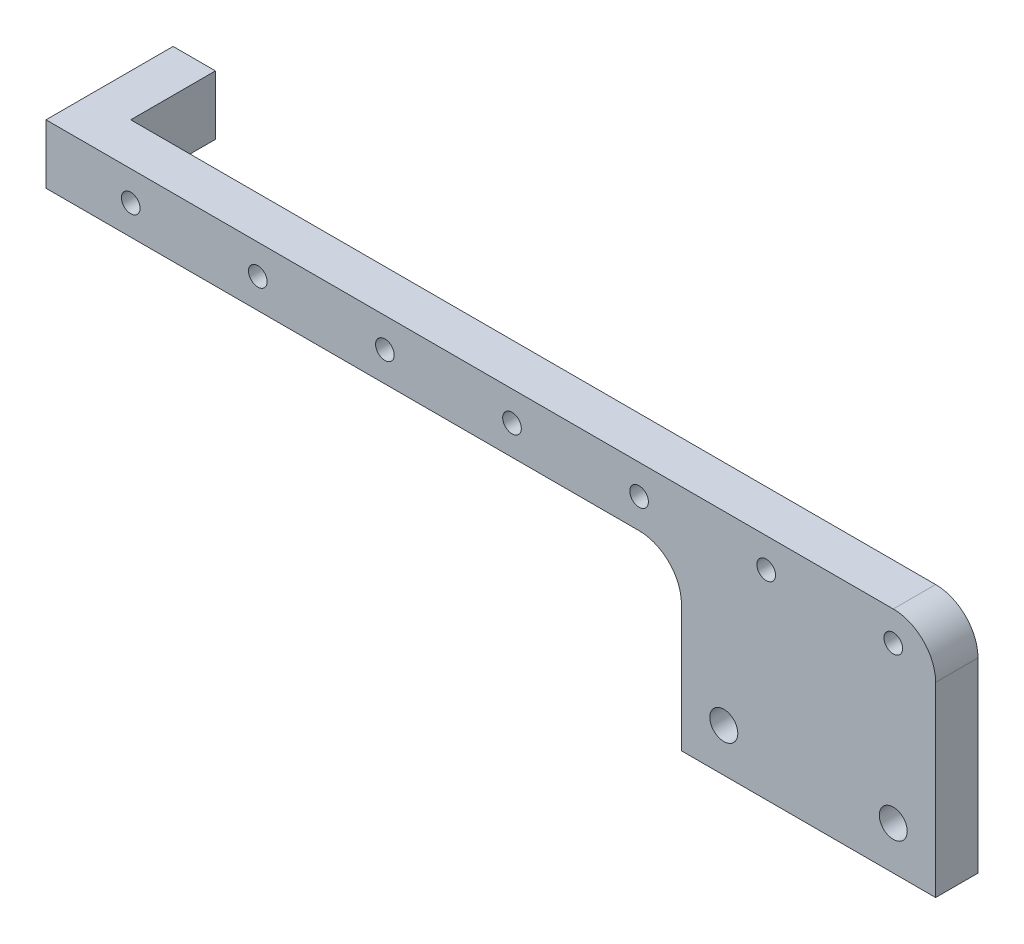
ISO-10303-21;
HEADER;
FILE_DESCRIPTION(('STEP AP214'),'2;1');
FILE_NAME('part.step','',(''),(''),'','','');
FILE_SCHEMA(('AUTOMOTIVE_DESIGN { 1 0 10303 214 1 1 1 1 }'));
ENDSEC;
DATA;
#1=APPLICATION_CONTEXT('core data for automotive mechanical design processes');
#2=APPLICATION_PROTOCOL_DEFINITION('international standard','automotive_design',2000,#1);
#3=PRODUCT_CONTEXT('',#1,'mechanical');
#4=PRODUCT('Part','Part','',(#3));
#5=PRODUCT_RELATED_PRODUCT_CATEGORY('part','',(#4));
#6=PRODUCT_DEFINITION_FORMATION('','',#4);
#7=PRODUCT_DEFINITION_CONTEXT('part definition',#1,'design');
#8=PRODUCT_DEFINITION('design','',#6,#7);
#9=PRODUCT_DEFINITION_SHAPE('','',#8);
#10=(LENGTH_UNIT() NAMED_UNIT(*) SI_UNIT(.MILLI.,.METRE.));
#11=(NAMED_UNIT(*) PLANE_ANGLE_UNIT() SI_UNIT($,.RADIAN.));
#12=(NAMED_UNIT(*) SI_UNIT($,.STERADIAN.) SOLID_ANGLE_UNIT());
#13=UNCERTAINTY_MEASURE_WITH_UNIT(LENGTH_MEASURE(1.E-05),#10,'distance_accuracy_value','');
#14=(GEOMETRIC_REPRESENTATION_CONTEXT(3) GLOBAL_UNCERTAINTY_ASSIGNED_CONTEXT((#13)) GLOBAL_UNIT_ASSIGNED_CONTEXT((#10,
#11,#12)) REPRESENTATION_CONTEXT('',''));
#15=CARTESIAN_POINT('',(0.,0.,0.));
#16=DIRECTION('',(0.,0.,1.));
#17=DIRECTION('',(1.,0.,0.));
#18=AXIS2_PLACEMENT_3D('',#15,#16,#17);
#19=CARTESIAN_POINT('',(0.,0.,5.));
#20=DIRECTION('',(0.,1.,0.));
#21=DIRECTION('',(0.,0.,1.));
#22=AXIS2_PLACEMENT_3D('',#19,#20,#21);
#23=PLANE('',#22);
#24=DIRECTION('',(1.,0.,0.));
#25=VECTOR('',#24,1.);
#26=CARTESIAN_POINT('',(0.,0.,0.));
#27=LINE('',#26,#25);
#28=CARTESIAN_POINT('',(0.,0.,0.));
#29=VERTEX_POINT('',#28);
#30=CARTESIAN_POINT('',(65.,0.,0.));
#31=VERTEX_POINT('',#30);
#32=EDGE_CURVE('E228',#29,#31,#27,.T.);
#33=ORIENTED_EDGE('',*,*,#32,.T.);
#34=DIRECTION('',(0.,0.,-1.));
#35=VECTOR('',#34,1.);
#36=CARTESIAN_POINT('',(65.,0.,5.));
#37=LINE('',#36,#35);
#38=CARTESIAN_POINT('',(65.,0.,5.));
#39=VERTEX_POINT('',#38);
#40=EDGE_CURVE('E234',#31,#39,#37,.F.);
#41=ORIENTED_EDGE('',*,*,#40,.T.);
#42=DIRECTION('',(1.,0.,0.));
#43=VECTOR('',#42,1.);
#44=CARTESIAN_POINT('',(0.,0.,5.));
#45=LINE('',#44,#43);
#46=CARTESIAN_POINT('',(-5.,0.,5.));
#47=VERTEX_POINT('',#46);
#48=EDGE_CURVE('E221',#47,#39,#45,.T.);
#49=ORIENTED_EDGE('',*,*,#48,.F.);
#50=DIRECTION('',(0.,0.,1.));
#51=VECTOR('',#50,1.);
#52=CARTESIAN_POINT('',(-5.,0.,-10.));
#53=LINE('',#52,#51);
#54=CARTESIAN_POINT('',(-5.,0.,-10.));
#55=VERTEX_POINT('',#54);
#56=EDGE_CURVE('E154',#55,#47,#53,.T.);
#57=ORIENTED_EDGE('',*,*,#56,.F.);
#58=DIRECTION('',(1.,0.,0.));
#59=VECTOR('',#58,1.);
#60=CARTESIAN_POINT('',(0.,0.,-10.));
#61=LINE('',#60,#59);
#62=CARTESIAN_POINT('',(0.,0.,-10.));
#63=VERTEX_POINT('',#62);
#64=EDGE_CURVE('E127',#55,#63,#61,.T.);
#65=ORIENTED_EDGE('',*,*,#64,.T.);
#66=DIRECTION('',(0.,0.,1.));
#67=VECTOR('',#66,1.);
#68=CARTESIAN_POINT('',(0.,0.,-10.));
#69=LINE('',#68,#67);
#70=EDGE_CURVE('E141',#63,#29,#69,.T.);
#71=ORIENTED_EDGE('',*,*,#70,.T.);
#72=EDGE_LOOP('',(#33,#41,#49,#57,#65,#71));
#73=FACE_BOUND('',#72,.T.);
#74=ADVANCED_FACE('F39',(#73),#23,.F.);
#75=CARTESIAN_POINT('',(0.,7.,5.));
#76=DIRECTION('',(0.,1.,0.));
#77=DIRECTION('',(0.,0.,1.));
#78=AXIS2_PLACEMENT_3D('',#75,#76,#77);
#79=PLANE('',#78);
#80=DIRECTION('',(1.,0.,0.));
#81=VECTOR('',#80,1.);
#82=CARTESIAN_POINT('',(0.,7.,5.));
#83=LINE('',#82,#81);
#84=CARTESIAN_POINT('',(-5.,7.,5.));
#85=VERTEX_POINT('',#84);
#86=CARTESIAN_POINT('',(95.,7.,5.));
#87=VERTEX_POINT('',#86);
#88=EDGE_CURVE('E216',#85,#87,#83,.T.);
#89=ORIENTED_EDGE('',*,*,#88,.T.);
#90=DIRECTION('',(0.,0.,-1.));
#91=VECTOR('',#90,1.);
#92=CARTESIAN_POINT('',(95.,7.,0.));
#93=LINE('',#92,#91);
#94=CARTESIAN_POINT('',(95.,7.,0.));
#95=VERTEX_POINT('',#94);
#96=EDGE_CURVE('E236',#87,#95,#93,.T.);
#97=ORIENTED_EDGE('',*,*,#96,.T.);
#98=DIRECTION('',(1.,0.,0.));
#99=VECTOR('',#98,1.);
#100=CARTESIAN_POINT('',(0.,7.,0.));
#101=LINE('',#100,#99);
#102=CARTESIAN_POINT('',(0.,7.,0.));
#103=VERTEX_POINT('',#102);
#104=EDGE_CURVE('E122',#103,#95,#101,.T.);
#105=ORIENTED_EDGE('',*,*,#104,.F.);
#106=DIRECTION('',(0.,0.,1.));
#107=VECTOR('',#106,1.);
#108=CARTESIAN_POINT('',(0.,7.,-10.));
#109=LINE('',#108,#107);
#110=CARTESIAN_POINT('',(0.,7.,-10.));
#111=VERTEX_POINT('',#110);
#112=EDGE_CURVE('E115',#111,#103,#109,.T.);
#113=ORIENTED_EDGE('',*,*,#112,.F.);
#114=DIRECTION('',(-1.,0.,0.));
#115=VECTOR('',#114,1.);
#116=CARTESIAN_POINT('',(0.,7.,-10.));
#117=LINE('',#116,#115);
#118=CARTESIAN_POINT('',(-5.,7.,-10.));
#119=VERTEX_POINT('',#118);
#120=EDGE_CURVE('E120',#111,#119,#117,.T.);
#121=ORIENTED_EDGE('',*,*,#120,.T.);
#122=DIRECTION('',(0.,0.,1.));
#123=VECTOR('',#122,1.);
#124=CARTESIAN_POINT('',(-5.,7.,-10.));
#125=LINE('',#124,#123);
#126=EDGE_CURVE('E126',#119,#85,#125,.T.);
#127=ORIENTED_EDGE('',*,*,#126,.T.);
#128=EDGE_LOOP('',(#89,#97,#105,#113,#121,#127));
#129=FACE_BOUND('',#128,.T.);
#130=ADVANCED_FACE('F118',(#129),#79,.T.);
#131=CARTESIAN_POINT('',(100.,0.,5.));
#132=DIRECTION('',(-1.,0.,0.));
#133=DIRECTION('',(0.,0.,1.));
#134=AXIS2_PLACEMENT_3D('',#131,#132,#133);
#135=PLANE('',#134);
#136=DIRECTION('',(0.,1.,0.));
#137=VECTOR('',#136,1.);
#138=CARTESIAN_POINT('',(100.,0.,0.));
#139=LINE('',#138,#137);
#140=CARTESIAN_POINT('',(100.,-20.,0.));
#141=VERTEX_POINT('',#140);
#142=CARTESIAN_POINT('',(100.,2.,0.));
#143=VERTEX_POINT('',#142);
#144=EDGE_CURVE('E226',#141,#143,#139,.T.);
#145=ORIENTED_EDGE('',*,*,#144,.T.);
#146=DIRECTION('',(0.,0.,-1.));
#147=VECTOR('',#146,1.);
#148=CARTESIAN_POINT('',(100.,2.,5.));
#149=LINE('',#148,#147);
#150=CARTESIAN_POINT('',(100.,2.,5.));
#151=VERTEX_POINT('',#150);
#152=EDGE_CURVE('E54',#143,#151,#149,.F.);
#153=ORIENTED_EDGE('',*,*,#152,.T.);
#154=DIRECTION('',(0.,1.,0.));
#155=VECTOR('',#154,1.);
#156=CARTESIAN_POINT('',(100.,0.,5.));
#157=LINE('',#156,#155);
#158=CARTESIAN_POINT('',(100.,-20.,5.));
#159=VERTEX_POINT('',#158);
#160=EDGE_CURVE('E218',#159,#151,#157,.T.);
#161=ORIENTED_EDGE('',*,*,#160,.F.);
#162=DIRECTION('',(0.,0.,-1.));
#163=VECTOR('',#162,1.);
#164=CARTESIAN_POINT('',(100.,-20.,5.));
#165=LINE('',#164,#163);
#166=EDGE_CURVE('E165',#159,#141,#165,.T.);
#167=ORIENTED_EDGE('',*,*,#166,.T.);
#168=EDGE_LOOP('',(#145,#153,#161,#167));
#169=FACE_BOUND('',#168,.T.);
#170=ADVANCED_FACE('F281',(#169),#135,.F.);
#171=CARTESIAN_POINT('',(0.,0.,5.));
#172=DIRECTION('',(0.,0.,1.));
#173=DIRECTION('',(1.,0.,0.));
#174=AXIS2_PLACEMENT_3D('',#171,#172,#173);
#175=PLANE('',#174);
#176=CARTESIAN_POINT('',(95.,-14.9,5.));
#177=DIRECTION('',(0.,0.,1.));
#178=DIRECTION('',(1.,0.,0.));
#179=AXIS2_PLACEMENT_3D('',#176,#177,#178);
#180=CIRCLE('',#179,1.65);
#181=CARTESIAN_POINT('',(96.65,-14.9,5.));
#182=VERTEX_POINT('',#181);
#183=EDGE_CURVE('E145',#182,#182,#180,.T.);
#184=ORIENTED_EDGE('',*,*,#183,.F.);
#185=EDGE_LOOP('',(#184));
#186=FACE_BOUND('',#185,.T.);
#187=CARTESIAN_POINT('',(75.,-14.9,5.));
#188=DIRECTION('',(0.,0.,1.));
#189=DIRECTION('',(1.,0.,0.));
#190=AXIS2_PLACEMENT_3D('',#187,#188,#189);
#191=CIRCLE('',#190,1.65);
#192=CARTESIAN_POINT('',(76.65,-14.9,5.));
#193=VERTEX_POINT('',#192);
#194=EDGE_CURVE('E307',#193,#193,#191,.T.);
#195=ORIENTED_EDGE('',*,*,#194,.F.);
#196=EDGE_LOOP('',(#195));
#197=FACE_BOUND('',#196,.T.);
#198=CARTESIAN_POINT('',(95.,3.5,5.));
#199=DIRECTION('',(0.,0.,-1.));
#200=DIRECTION('',(-1.,0.,0.));
#201=AXIS2_PLACEMENT_3D('',#198,#199,#200);
#202=CIRCLE('',#201,1.10000000000001);
#203=CARTESIAN_POINT('',(93.9,3.5,5.));
#204=VERTEX_POINT('',#203);
#205=EDGE_CURVE('E175',#204,#204,#202,.T.);
#206=ORIENTED_EDGE('',*,*,#205,.T.);
#207=EDGE_LOOP('',(#206));
#208=FACE_BOUND('',#207,.T.);
#209=CARTESIAN_POINT('',(80.,3.5,5.));
#210=DIRECTION('',(0.,0.,-1.));
#211=DIRECTION('',(-1.,0.,0.));
#212=AXIS2_PLACEMENT_3D('',#209,#210,#211);
#213=CIRCLE('',#212,1.10000000000001);
#214=CARTESIAN_POINT('',(78.9,3.5,5.));
#215=VERTEX_POINT('',#214);
#216=EDGE_CURVE('E184',#215,#215,#213,.T.);
#217=ORIENTED_EDGE('',*,*,#216,.T.);
#218=EDGE_LOOP('',(#217));
#219=FACE_BOUND('',#218,.T.);
#220=CARTESIAN_POINT('',(65.,3.5,5.));
#221=DIRECTION('',(0.,0.,-1.));
#222=DIRECTION('',(-1.,0.,0.));
#223=AXIS2_PLACEMENT_3D('',#220,#221,#222);
#224=CIRCLE('',#223,1.10000000000001);
#225=CARTESIAN_POINT('',(63.9,3.5,5.));
#226=VERTEX_POINT('',#225);
#227=EDGE_CURVE('E190',#226,#226,#224,.T.);
#228=ORIENTED_EDGE('',*,*,#227,.T.);
#229=EDGE_LOOP('',(#228));
#230=FACE_BOUND('',#229,.T.);
#231=CARTESIAN_POINT('',(50.,3.5,5.));
#232=DIRECTION('',(0.,0.,-1.));
#233=DIRECTION('',(-1.,0.,0.));
#234=AXIS2_PLACEMENT_3D('',#231,#232,#233);
#235=CIRCLE('',#234,1.10000000000001);
#236=CARTESIAN_POINT('',(48.9,3.5,5.));
#237=VERTEX_POINT('',#236);
#238=EDGE_CURVE('E196',#237,#237,#235,.T.);
#239=ORIENTED_EDGE('',*,*,#238,.T.);
#240=EDGE_LOOP('',(#239));
#241=FACE_BOUND('',#240,.T.);
#242=CARTESIAN_POINT('',(35.,3.5,5.));
#243=DIRECTION('',(0.,0.,-1.));
#244=DIRECTION('',(-1.,0.,0.));
#245=AXIS2_PLACEMENT_3D('',#242,#243,#244);
#246=CIRCLE('',#245,1.10000000000001);
#247=CARTESIAN_POINT('',(33.9,3.5,5.));
#248=VERTEX_POINT('',#247);
#249=EDGE_CURVE('E202',#248,#248,#246,.T.);
#250=ORIENTED_EDGE('',*,*,#249,.T.);
#251=EDGE_LOOP('',(#250));
#252=FACE_BOUND('',#251,.T.);
#253=CARTESIAN_POINT('',(20.,3.5,5.));
#254=DIRECTION('',(0.,0.,-1.));
#255=DIRECTION('',(-1.,0.,0.));
#256=AXIS2_PLACEMENT_3D('',#253,#254,#255);
#257=CIRCLE('',#256,1.10000000000001);
#258=CARTESIAN_POINT('',(18.9,3.5,5.));
#259=VERTEX_POINT('',#258);
#260=EDGE_CURVE('E208',#259,#259,#257,.T.);
#261=ORIENTED_EDGE('',*,*,#260,.T.);
#262=EDGE_LOOP('',(#261));
#263=FACE_BOUND('',#262,.T.);
#264=CARTESIAN_POINT('',(4.99999999999999,3.5,5.));
#265=DIRECTION('',(0.,0.,-1.));
#266=DIRECTION('',(-1.,0.,0.));
#267=AXIS2_PLACEMENT_3D('',#264,#265,#266);
#268=CIRCLE('',#267,1.10000000000001);
#269=CARTESIAN_POINT('',(3.89999999999998,3.5,5.));
#270=VERTEX_POINT('',#269);
#271=EDGE_CURVE('E172',#270,#270,#268,.T.);
#272=ORIENTED_EDGE('',*,*,#271,.T.);
#273=EDGE_LOOP('',(#272));
#274=FACE_BOUND('',#273,.T.);
#275=ORIENTED_EDGE('',*,*,#160,.T.);
#276=CARTESIAN_POINT('',(95.,2.,5.));
#277=DIRECTION('',(0.,0.,1.));
#278=DIRECTION('',(1.,0.,0.));
#279=AXIS2_PLACEMENT_3D('',#276,#277,#278);
#280=CIRCLE('',#279,5.);
#281=EDGE_CURVE('E240',#151,#87,#280,.T.);
#282=ORIENTED_EDGE('',*,*,#281,.T.);
#283=ORIENTED_EDGE('',*,*,#88,.F.);
#284=DIRECTION('',(0.,-1.,0.));
#285=VECTOR('',#284,1.);
#286=CARTESIAN_POINT('',(-5.,0.,5.));
#287=LINE('',#286,#285);
#288=EDGE_CURVE('E142',#85,#47,#287,.T.);
#289=ORIENTED_EDGE('',*,*,#288,.T.);
#290=ORIENTED_EDGE('',*,*,#48,.T.);
#291=CARTESIAN_POINT('',(65.,-5.,5.));
#292=DIRECTION('',(0.,0.,1.));
#293=DIRECTION('',(1.,0.,0.));
#294=AXIS2_PLACEMENT_3D('',#291,#292,#293);
#295=CIRCLE('',#294,5.);
#296=CARTESIAN_POINT('',(70.,-5.,5.));
#297=VERTEX_POINT('',#296);
#298=EDGE_CURVE('E11',#39,#297,#295,.F.);
#299=ORIENTED_EDGE('',*,*,#298,.T.);
#300=DIRECTION('',(0.,1.,0.));
#301=VECTOR('',#300,1.);
#302=CARTESIAN_POINT('',(70.,0.,5.));
#303=LINE('',#302,#301);
#304=CARTESIAN_POINT('',(70.,-20.,5.));
#305=VERTEX_POINT('',#304);
#306=EDGE_CURVE('E161',#305,#297,#303,.T.);
#307=ORIENTED_EDGE('',*,*,#306,.F.);
#308=DIRECTION('',(-1.,0.,0.));
#309=VECTOR('',#308,1.);
#310=CARTESIAN_POINT('',(100.,-20.,5.));
#311=LINE('',#310,#309);
#312=EDGE_CURVE('E158',#159,#305,#311,.T.);
#313=ORIENTED_EDGE('',*,*,#312,.F.);
#314=EDGE_LOOP('',(#275,#282,#283,#289,#290,#299,#307,#313));
#315=FACE_BOUND('',#314,.T.);
#316=ADVANCED_FACE('F252',(#186,#197,#208,#219,#230,#241,#252,#263,#274,#315),#175,.T.);
#317=CARTESIAN_POINT('',(0.,0.,0.));
#318=DIRECTION('',(0.,0.,1.));
#319=DIRECTION('',(1.,0.,0.));
#320=AXIS2_PLACEMENT_3D('',#317,#318,#319);
#321=PLANE('',#320);
#322=CARTESIAN_POINT('',(95.,-14.9,0.));
#323=DIRECTION('',(0.,0.,-1.));
#324=DIRECTION('',(-1.,0.,0.));
#325=AXIS2_PLACEMENT_3D('',#322,#323,#324);
#326=CIRCLE('',#325,1.65);
#327=CARTESIAN_POINT('',(93.35,-14.9,0.));
#328=VERTEX_POINT('',#327);
#329=EDGE_CURVE('E305',#328,#328,#326,.T.);
#330=ORIENTED_EDGE('',*,*,#329,.F.);
#331=EDGE_LOOP('',(#330));
#332=FACE_BOUND('',#331,.T.);
#333=CARTESIAN_POINT('',(75.,-14.9,0.));
#334=DIRECTION('',(0.,0.,-1.));
#335=DIRECTION('',(-1.,0.,0.));
#336=AXIS2_PLACEMENT_3D('',#333,#334,#335);
#337=CIRCLE('',#336,1.65);
#338=CARTESIAN_POINT('',(73.35,-14.9,0.));
#339=VERTEX_POINT('',#338);
#340=EDGE_CURVE('E308',#339,#339,#337,.T.);
#341=ORIENTED_EDGE('',*,*,#340,.F.);
#342=EDGE_LOOP('',(#341));
#343=FACE_BOUND('',#342,.T.);
#344=CARTESIAN_POINT('',(95.,3.5,0.));
#345=DIRECTION('',(0.,0.,-1.));
#346=DIRECTION('',(-1.,0.,0.));
#347=AXIS2_PLACEMENT_3D('',#344,#345,#346);
#348=CIRCLE('',#347,1.10000000000001);
#349=CARTESIAN_POINT('',(93.9,3.5,0.));
#350=VERTEX_POINT('',#349);
#351=EDGE_CURVE('E178',#350,#350,#348,.T.);
#352=ORIENTED_EDGE('',*,*,#351,.F.);
#353=EDGE_LOOP('',(#352));
#354=FACE_BOUND('',#353,.T.);
#355=CARTESIAN_POINT('',(80.,3.5,0.));
#356=DIRECTION('',(0.,0.,-1.));
#357=DIRECTION('',(-1.,0.,0.));
#358=AXIS2_PLACEMENT_3D('',#355,#356,#357);
#359=CIRCLE('',#358,1.10000000000001);
#360=CARTESIAN_POINT('',(78.9,3.5,0.));
#361=VERTEX_POINT('',#360);
#362=EDGE_CURVE('E181',#361,#361,#359,.T.);
#363=ORIENTED_EDGE('',*,*,#362,.F.);
#364=EDGE_LOOP('',(#363));
#365=FACE_BOUND('',#364,.T.);
#366=CARTESIAN_POINT('',(65.,3.5,0.));
#367=DIRECTION('',(0.,0.,-1.));
#368=DIRECTION('',(-1.,0.,0.));
#369=AXIS2_PLACEMENT_3D('',#366,#367,#368);
#370=CIRCLE('',#369,1.10000000000001);
#371=CARTESIAN_POINT('',(63.9,3.5,0.));
#372=VERTEX_POINT('',#371);
#373=EDGE_CURVE('E187',#372,#372,#370,.T.);
#374=ORIENTED_EDGE('',*,*,#373,.F.);
#375=EDGE_LOOP('',(#374));
#376=FACE_BOUND('',#375,.T.);
#377=CARTESIAN_POINT('',(50.,3.5,0.));
#378=DIRECTION('',(0.,0.,-1.));
#379=DIRECTION('',(-1.,0.,0.));
#380=AXIS2_PLACEMENT_3D('',#377,#378,#379);
#381=CIRCLE('',#380,1.10000000000001);
#382=CARTESIAN_POINT('',(48.9,3.5,0.));
#383=VERTEX_POINT('',#382);
#384=EDGE_CURVE('E193',#383,#383,#381,.T.);
#385=ORIENTED_EDGE('',*,*,#384,.F.);
#386=EDGE_LOOP('',(#385));
#387=FACE_BOUND('',#386,.T.);
#388=CARTESIAN_POINT('',(35.,3.5,0.));
#389=DIRECTION('',(0.,0.,-1.));
#390=DIRECTION('',(-1.,0.,0.));
#391=AXIS2_PLACEMENT_3D('',#388,#389,#390);
#392=CIRCLE('',#391,1.10000000000001);
#393=CARTESIAN_POINT('',(33.9,3.5,0.));
#394=VERTEX_POINT('',#393);
#395=EDGE_CURVE('E199',#394,#394,#392,.T.);
#396=ORIENTED_EDGE('',*,*,#395,.F.);
#397=EDGE_LOOP('',(#396));
#398=FACE_BOUND('',#397,.T.);
#399=CARTESIAN_POINT('',(20.,3.5,0.));
#400=DIRECTION('',(0.,0.,-1.));
#401=DIRECTION('',(-1.,0.,0.));
#402=AXIS2_PLACEMENT_3D('',#399,#400,#401);
#403=CIRCLE('',#402,1.10000000000001);
#404=CARTESIAN_POINT('',(18.9,3.5,0.));
#405=VERTEX_POINT('',#404);
#406=EDGE_CURVE('E205',#405,#405,#403,.T.);
#407=ORIENTED_EDGE('',*,*,#406,.F.);
#408=EDGE_LOOP('',(#407));
#409=FACE_BOUND('',#408,.T.);
#410=CARTESIAN_POINT('',(4.99999999999999,3.5,0.));
#411=DIRECTION('',(0.,0.,-1.));
#412=DIRECTION('',(-1.,0.,0.));
#413=AXIS2_PLACEMENT_3D('',#410,#411,#412);
#414=CIRCLE('',#413,1.10000000000001);
#415=CARTESIAN_POINT('',(3.89999999999998,3.5,0.));
#416=VERTEX_POINT('',#415);
#417=EDGE_CURVE('E211',#416,#416,#414,.T.);
#418=ORIENTED_EDGE('',*,*,#417,.F.);
#419=EDGE_LOOP('',(#418));
#420=FACE_BOUND('',#419,.T.);
#421=ORIENTED_EDGE('',*,*,#104,.T.);
#422=CARTESIAN_POINT('',(95.,2.,0.));
#423=DIRECTION('',(0.,0.,1.));
#424=DIRECTION('',(1.,0.,0.));
#425=AXIS2_PLACEMENT_3D('',#422,#423,#424);
#426=CIRCLE('',#425,5.);
#427=EDGE_CURVE('E62',#95,#143,#426,.F.);
#428=ORIENTED_EDGE('',*,*,#427,.T.);
#429=ORIENTED_EDGE('',*,*,#144,.F.);
#430=DIRECTION('',(-1.,0.,0.));
#431=VECTOR('',#430,1.);
#432=CARTESIAN_POINT('',(100.,-20.,0.));
#433=LINE('',#432,#431);
#434=CARTESIAN_POINT('',(70.,-20.,0.));
#435=VERTEX_POINT('',#434);
#436=EDGE_CURVE('E153',#141,#435,#433,.T.);
#437=ORIENTED_EDGE('',*,*,#436,.T.);
#438=DIRECTION('',(0.,1.,0.));
#439=VECTOR('',#438,1.);
#440=CARTESIAN_POINT('',(70.,0.,0.));
#441=LINE('',#440,#439);
#442=CARTESIAN_POINT('',(70.,-5.,0.));
#443=VERTEX_POINT('',#442);
#444=EDGE_CURVE('E162',#435,#443,#441,.T.);
#445=ORIENTED_EDGE('',*,*,#444,.T.);
#446=CARTESIAN_POINT('',(65.,-5.,0.));
#447=DIRECTION('',(0.,0.,1.));
#448=DIRECTION('',(1.,0.,0.));
#449=AXIS2_PLACEMENT_3D('',#446,#447,#448);
#450=CIRCLE('',#449,5.);
#451=EDGE_CURVE('E47',#443,#31,#450,.T.);
#452=ORIENTED_EDGE('',*,*,#451,.T.);
#453=ORIENTED_EDGE('',*,*,#32,.F.);
#454=DIRECTION('',(0.,1.,0.));
#455=VECTOR('',#454,1.);
#456=CARTESIAN_POINT('',(0.,0.,0.));
#457=LINE('',#456,#455);
#458=EDGE_CURVE('E219',#29,#103,#457,.T.);
#459=ORIENTED_EDGE('',*,*,#458,.T.);
#460=EDGE_LOOP('',(#421,#428,#429,#437,#445,#452,#453,#459));
#461=FACE_BOUND('',#460,.T.);
#462=ADVANCED_FACE('F242',(#332,#343,#354,#365,#376,#387,#398,#409,#420,#461),#321,.F.);
#463=CARTESIAN_POINT('',(4.99999999999999,3.5,5.));
#464=DIRECTION('',(0.,0.,-1.));
#465=DIRECTION('',(-1.,0.,0.));
#466=AXIS2_PLACEMENT_3D('',#463,#464,#465);
#467=CYLINDRICAL_SURFACE('',#466,1.10000000000001);
#468=ORIENTED_EDGE('',*,*,#271,.F.);
#469=EDGE_LOOP('',(#468));
#470=FACE_BOUND('',#469,.T.);
#471=ORIENTED_EDGE('',*,*,#417,.T.);
#472=EDGE_LOOP('',(#471));
#473=FACE_BOUND('',#472,.T.);
#474=ADVANCED_FACE('F318',(#470,#473),#467,.F.);
#475=CARTESIAN_POINT('',(20.,3.5,5.));
#476=DIRECTION('',(0.,0.,-1.));
#477=DIRECTION('',(-1.,0.,0.));
#478=AXIS2_PLACEMENT_3D('',#475,#476,#477);
#479=CYLINDRICAL_SURFACE('',#478,1.10000000000001);
#480=ORIENTED_EDGE('',*,*,#260,.F.);
#481=EDGE_LOOP('',(#480));
#482=FACE_BOUND('',#481,.T.);
#483=ORIENTED_EDGE('',*,*,#406,.T.);
#484=EDGE_LOOP('',(#483));
#485=FACE_BOUND('',#484,.T.);
#486=ADVANCED_FACE('F334',(#482,#485),#479,.F.);
#487=CARTESIAN_POINT('',(35.,3.5,5.));
#488=DIRECTION('',(0.,0.,-1.));
#489=DIRECTION('',(-1.,0.,0.));
#490=AXIS2_PLACEMENT_3D('',#487,#488,#489);
#491=CYLINDRICAL_SURFACE('',#490,1.10000000000001);
#492=ORIENTED_EDGE('',*,*,#249,.F.);
#493=EDGE_LOOP('',(#492));
#494=FACE_BOUND('',#493,.T.);
#495=ORIENTED_EDGE('',*,*,#395,.T.);
#496=EDGE_LOOP('',(#495));
#497=FACE_BOUND('',#496,.T.);
#498=ADVANCED_FACE('F340',(#494,#497),#491,.F.);
#499=CARTESIAN_POINT('',(50.,3.5,5.));
#500=DIRECTION('',(0.,0.,-1.));
#501=DIRECTION('',(-1.,0.,0.));
#502=AXIS2_PLACEMENT_3D('',#499,#500,#501);
#503=CYLINDRICAL_SURFACE('',#502,1.10000000000001);
#504=ORIENTED_EDGE('',*,*,#238,.F.);
#505=EDGE_LOOP('',(#504));
#506=FACE_BOUND('',#505,.T.);
#507=ORIENTED_EDGE('',*,*,#384,.T.);
#508=EDGE_LOOP('',(#507));
#509=FACE_BOUND('',#508,.T.);
#510=ADVANCED_FACE('F368',(#506,#509),#503,.F.);
#511=CARTESIAN_POINT('',(65.,3.5,5.));
#512=DIRECTION('',(0.,0.,-1.));
#513=DIRECTION('',(-1.,0.,0.));
#514=AXIS2_PLACEMENT_3D('',#511,#512,#513);
#515=CYLINDRICAL_SURFACE('',#514,1.10000000000001);
#516=ORIENTED_EDGE('',*,*,#227,.F.);
#517=EDGE_LOOP('',(#516));
#518=FACE_BOUND('',#517,.T.);
#519=ORIENTED_EDGE('',*,*,#373,.T.);
#520=EDGE_LOOP('',(#519));
#521=FACE_BOUND('',#520,.T.);
#522=ADVANCED_FACE('F372',(#518,#521),#515,.F.);
#523=CARTESIAN_POINT('',(80.,3.5,5.));
#524=DIRECTION('',(0.,0.,-1.));
#525=DIRECTION('',(-1.,0.,0.));
#526=AXIS2_PLACEMENT_3D('',#523,#524,#525);
#527=CYLINDRICAL_SURFACE('',#526,1.10000000000001);
#528=ORIENTED_EDGE('',*,*,#216,.F.);
#529=EDGE_LOOP('',(#528));
#530=FACE_BOUND('',#529,.T.);
#531=ORIENTED_EDGE('',*,*,#362,.T.);
#532=EDGE_LOOP('',(#531));
#533=FACE_BOUND('',#532,.T.);
#534=ADVANCED_FACE('F378',(#530,#533),#527,.F.);
#535=CARTESIAN_POINT('',(95.,3.5,5.));
#536=DIRECTION('',(0.,0.,-1.));
#537=DIRECTION('',(-1.,0.,0.));
#538=AXIS2_PLACEMENT_3D('',#535,#536,#537);
#539=CYLINDRICAL_SURFACE('',#538,1.10000000000001);
#540=ORIENTED_EDGE('',*,*,#205,.F.);
#541=EDGE_LOOP('',(#540));
#542=FACE_BOUND('',#541,.T.);
#543=ORIENTED_EDGE('',*,*,#351,.T.);
#544=EDGE_LOOP('',(#543));
#545=FACE_BOUND('',#544,.T.);
#546=ADVANCED_FACE('F382',(#542,#545),#539,.F.);
#547=CARTESIAN_POINT('',(70.,0.,5.));
#548=DIRECTION('',(-1.,0.,0.));
#549=DIRECTION('',(0.,0.,1.));
#550=AXIS2_PLACEMENT_3D('',#547,#548,#549);
#551=PLANE('',#550);
#552=ORIENTED_EDGE('',*,*,#306,.T.);
#553=DIRECTION('',(0.,0.,-1.));
#554=VECTOR('',#553,1.);
#555=CARTESIAN_POINT('',(70.,-5.,5.));
#556=LINE('',#555,#554);
#557=EDGE_CURVE('E224',#297,#443,#556,.T.);
#558=ORIENTED_EDGE('',*,*,#557,.T.);
#559=ORIENTED_EDGE('',*,*,#444,.F.);
#560=DIRECTION('',(0.,0.,-1.));
#561=VECTOR('',#560,1.);
#562=CARTESIAN_POINT('',(70.,-20.,5.));
#563=LINE('',#562,#561);
#564=EDGE_CURVE('E170',#305,#435,#563,.T.);
#565=ORIENTED_EDGE('',*,*,#564,.F.);
#566=EDGE_LOOP('',(#552,#558,#559,#565));
#567=FACE_BOUND('',#566,.T.);
#568=ADVANCED_FACE('F255',(#567),#551,.T.);
#569=CARTESIAN_POINT('',(100.,-20.,5.));
#570=DIRECTION('',(0.,-1.,0.));
#571=DIRECTION('',(0.,0.,-1.));
#572=AXIS2_PLACEMENT_3D('',#569,#570,#571);
#573=PLANE('',#572);
#574=ORIENTED_EDGE('',*,*,#436,.F.);
#575=ORIENTED_EDGE('',*,*,#166,.F.);
#576=ORIENTED_EDGE('',*,*,#312,.T.);
#577=ORIENTED_EDGE('',*,*,#564,.T.);
#578=EDGE_LOOP('',(#574,#575,#576,#577));
#579=FACE_BOUND('',#578,.T.);
#580=ADVANCED_FACE('F258',(#579),#573,.T.);
#581=CARTESIAN_POINT('',(0.,0.,-10.));
#582=DIRECTION('',(1.,0.,0.));
#583=DIRECTION('',(0.,0.,-1.));
#584=AXIS2_PLACEMENT_3D('',#581,#582,#583);
#585=PLANE('',#584);
#586=ORIENTED_EDGE('',*,*,#458,.F.);
#587=ORIENTED_EDGE('',*,*,#70,.F.);
#588=DIRECTION('',(0.,1.,0.));
#589=VECTOR('',#588,1.);
#590=CARTESIAN_POINT('',(0.,0.,-10.));
#591=LINE('',#590,#589);
#592=EDGE_CURVE('E134',#63,#111,#591,.T.);
#593=ORIENTED_EDGE('',*,*,#592,.T.);
#594=ORIENTED_EDGE('',*,*,#112,.T.);
#595=EDGE_LOOP('',(#586,#587,#593,#594));
#596=FACE_BOUND('',#595,.T.);
#597=ADVANCED_FACE('F139',(#596),#585,.T.);
#598=CARTESIAN_POINT('',(-5.,0.,-10.));
#599=DIRECTION('',(-1.,0.,0.));
#600=DIRECTION('',(0.,-1.,0.));
#601=AXIS2_PLACEMENT_3D('',#598,#599,#600);
#602=PLANE('',#601);
#603=ORIENTED_EDGE('',*,*,#288,.F.);
#604=ORIENTED_EDGE('',*,*,#126,.F.);
#605=DIRECTION('',(0.,-1.,0.));
#606=VECTOR('',#605,1.);
#607=CARTESIAN_POINT('',(-5.,0.,-10.));
#608=LINE('',#607,#606);
#609=EDGE_CURVE('E137',#119,#55,#608,.T.);
#610=ORIENTED_EDGE('',*,*,#609,.T.);
#611=ORIENTED_EDGE('',*,*,#56,.T.);
#612=EDGE_LOOP('',(#603,#604,#610,#611));
#613=FACE_BOUND('',#612,.T.);
#614=ADVANCED_FACE('F265',(#613),#602,.T.);
#615=CARTESIAN_POINT('',(0.,0.,-10.));
#616=DIRECTION('',(0.,0.,1.));
#617=DIRECTION('',(1.,0.,0.));
#618=AXIS2_PLACEMENT_3D('',#615,#616,#617);
#619=PLANE('',#618);
#620=ORIENTED_EDGE('',*,*,#592,.F.);
#621=ORIENTED_EDGE('',*,*,#64,.F.);
#622=ORIENTED_EDGE('',*,*,#609,.F.);
#623=ORIENTED_EDGE('',*,*,#120,.F.);
#624=EDGE_LOOP('',(#620,#621,#622,#623));
#625=FACE_BOUND('',#624,.T.);
#626=ADVANCED_FACE('F132',(#625),#619,.F.);
#627=CARTESIAN_POINT('',(75.,-14.9,15.));
#628=DIRECTION('',(0.,0.,-1.));
#629=DIRECTION('',(-1.,0.,0.));
#630=AXIS2_PLACEMENT_3D('',#627,#628,#629);
#631=CYLINDRICAL_SURFACE('',#630,1.65);
#632=ORIENTED_EDGE('',*,*,#194,.T.);
#633=EDGE_LOOP('',(#632));
#634=FACE_BOUND('',#633,.T.);
#635=ORIENTED_EDGE('',*,*,#340,.T.);
#636=EDGE_LOOP('',(#635));
#637=FACE_BOUND('',#636,.T.);
#638=ADVANCED_FACE('F272',(#634,#637),#631,.F.);
#639=CARTESIAN_POINT('',(95.,-14.9,15.));
#640=DIRECTION('',(0.,0.,-1.));
#641=DIRECTION('',(-1.,0.,0.));
#642=AXIS2_PLACEMENT_3D('',#639,#640,#641);
#643=CYLINDRICAL_SURFACE('',#642,1.65);
#644=ORIENTED_EDGE('',*,*,#183,.T.);
#645=EDGE_LOOP('',(#644));
#646=FACE_BOUND('',#645,.T.);
#647=ORIENTED_EDGE('',*,*,#329,.T.);
#648=EDGE_LOOP('',(#647));
#649=FACE_BOUND('',#648,.T.);
#650=ADVANCED_FACE('F288',(#646,#649),#643,.F.);
#651=CARTESIAN_POINT('',(65.,-5.,5.));
#652=DIRECTION('',(0.,0.,-1.));
#653=DIRECTION('',(-1.,0.,0.));
#654=AXIS2_PLACEMENT_3D('',#651,#652,#653);
#655=CYLINDRICAL_SURFACE('',#654,5.);
#656=ORIENTED_EDGE('',*,*,#298,.F.);
#657=ORIENTED_EDGE('',*,*,#40,.F.);
#658=ORIENTED_EDGE('',*,*,#451,.F.);
#659=ORIENTED_EDGE('',*,*,#557,.F.);
#660=EDGE_LOOP('',(#656,#657,#658,#659));
#661=FACE_BOUND('',#660,.T.);
#662=ADVANCED_FACE('F249',(#661),#655,.F.);
#663=CARTESIAN_POINT('',(95.,2.,5.));
#664=DIRECTION('',(0.,0.,1.));
#665=DIRECTION('',(1.,0.,0.));
#666=AXIS2_PLACEMENT_3D('',#663,#664,#665);
#667=CYLINDRICAL_SURFACE('',#666,5.);
#668=ORIENTED_EDGE('',*,*,#281,.F.);
#669=ORIENTED_EDGE('',*,*,#152,.F.);
#670=ORIENTED_EDGE('',*,*,#427,.F.);
#671=ORIENTED_EDGE('',*,*,#96,.F.);
#672=EDGE_LOOP('',(#668,#669,#670,#671));
#673=FACE_BOUND('',#672,.T.);
#674=ADVANCED_FACE('F41',(#673),#667,.T.);
#675=CLOSED_SHELL('',(#74,#130,#170,#316,#462,#474,#486,#498,#510,#522,#534,#546,#568,#580,#597,
#614,#626,#638,#650,#662,#674));
#676=MANIFOLD_SOLID_BREP('B2',#675);
#677=ADVANCED_BREP_SHAPE_REPRESENTATION('',(#18,#676),#14);
#678=SHAPE_DEFINITION_REPRESENTATION(#9,#677);
ENDSEC;
END-ISO-10303-21;
